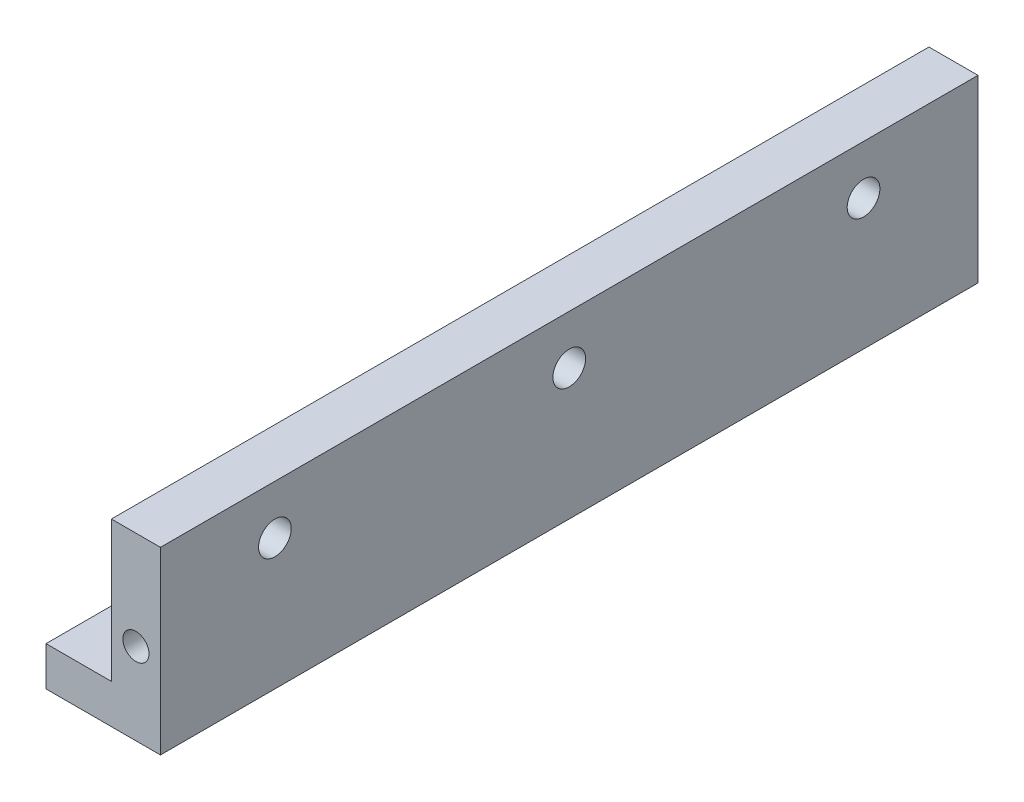
ISO-10303-21;
HEADER;
FILE_DESCRIPTION(('STEP AP214'),'2;1');
FILE_NAME('part.step','',(''),(''),'','','');
FILE_SCHEMA(('AUTOMOTIVE_DESIGN { 1 0 10303 214 1 1 1 1 }'));
ENDSEC;
DATA;
#1=APPLICATION_CONTEXT('core data for automotive mechanical design processes');
#2=APPLICATION_PROTOCOL_DEFINITION('international standard','automotive_design',2000,#1);
#3=PRODUCT_CONTEXT('',#1,'mechanical');
#4=PRODUCT('Part','Part','',(#3));
#5=PRODUCT_RELATED_PRODUCT_CATEGORY('part','',(#4));
#6=PRODUCT_DEFINITION_FORMATION('','',#4);
#7=PRODUCT_DEFINITION_CONTEXT('part definition',#1,'design');
#8=PRODUCT_DEFINITION('design','',#6,#7);
#9=PRODUCT_DEFINITION_SHAPE('','',#8);
#10=(LENGTH_UNIT() NAMED_UNIT(*) SI_UNIT(.MILLI.,.METRE.));
#11=(NAMED_UNIT(*) PLANE_ANGLE_UNIT() SI_UNIT($,.RADIAN.));
#12=(NAMED_UNIT(*) SI_UNIT($,.STERADIAN.) SOLID_ANGLE_UNIT());
#13=UNCERTAINTY_MEASURE_WITH_UNIT(LENGTH_MEASURE(1.E-05),#10,'distance_accuracy_value','');
#14=(GEOMETRIC_REPRESENTATION_CONTEXT(3) GLOBAL_UNCERTAINTY_ASSIGNED_CONTEXT((#13)) GLOBAL_UNIT_ASSIGNED_CONTEXT((#10,
#11,#12)) REPRESENTATION_CONTEXT('',''));
#15=CARTESIAN_POINT('',(0.,0.,0.));
#16=DIRECTION('',(0.,0.,1.));
#17=DIRECTION('',(1.,0.,0.));
#18=AXIS2_PLACEMENT_3D('',#15,#16,#17);
#19=CARTESIAN_POINT('',(9.98039404339138,208.805223982166,-315.192024052027));
#20=DIRECTION('',(0.,1.,0.));
#21=DIRECTION('',(0.,0.,1.));
#22=AXIS2_PLACEMENT_3D('',#19,#20,#21);
#23=PLANE('',#22);
#24=DIRECTION('',(0.,0.,1.));
#25=VECTOR('',#24,1.);
#26=CARTESIAN_POINT('',(9.98039404339138,208.805223982166,-315.192024052027));
#27=LINE('',#26,#25);
#28=CARTESIAN_POINT('',(9.98039404339138,208.805223982166,-250.));
#29=VERTEX_POINT('',#28);
#30=CARTESIAN_POINT('',(9.98039404339138,208.805223982166,0.));
#31=VERTEX_POINT('',#30);
#32=EDGE_CURVE('E96',#29,#31,#27,.T.);
#33=ORIENTED_EDGE('',*,*,#32,.F.);
#34=DIRECTION('',(-1.,0.,0.));
#35=VECTOR('',#34,1.);
#36=CARTESIAN_POINT('',(9.98039404339138,208.805223982166,-250.));
#37=LINE('',#36,#35);
#38=CARTESIAN_POINT('',(-5.01960595660862,208.805223982166,-250.));
#39=VERTEX_POINT('',#38);
#40=EDGE_CURVE('E126',#29,#39,#37,.T.);
#41=ORIENTED_EDGE('',*,*,#40,.T.);
#42=DIRECTION('',(0.,0.,1.));
#43=VECTOR('',#42,1.);
#44=CARTESIAN_POINT('',(-5.01960595660862,208.805223982166,-315.192024052027));
#45=LINE('',#44,#43);
#46=CARTESIAN_POINT('',(-5.01960595660862,208.805223982166,0.));
#47=VERTEX_POINT('',#46);
#48=EDGE_CURVE('E37',#39,#47,#45,.T.);
#49=ORIENTED_EDGE('',*,*,#48,.T.);
#50=DIRECTION('',(-1.,0.,0.));
#51=VECTOR('',#50,1.);
#52=CARTESIAN_POINT('',(9.98039404339138,208.805223982166,0.));
#53=LINE('',#52,#51);
#54=EDGE_CURVE('E121',#31,#47,#53,.T.);
#55=ORIENTED_EDGE('',*,*,#54,.F.);
#56=EDGE_LOOP('',(#33,#41,#49,#55));
#57=FACE_BOUND('',#56,.T.);
#58=ADVANCED_FACE('F33',(#57),#23,.T.);
#59=CARTESIAN_POINT('',(9.98039404339139,153.805223982166,-315.192024052027));
#60=DIRECTION('',(1.,0.,0.));
#61=DIRECTION('',(0.,1.,0.));
#62=AXIS2_PLACEMENT_3D('',#59,#60,#61);
#63=PLANE('',#62);
#64=CARTESIAN_POINT('',(9.98039404339139,193.805223982166,-35.));
#65=DIRECTION('',(1.,0.,0.));
#66=DIRECTION('',(0.,1.,0.));
#67=AXIS2_PLACEMENT_3D('',#64,#65,#66);
#68=CIRCLE('',#67,5.00000000000001);
#69=CARTESIAN_POINT('',(9.98039404339139,188.805223982166,-35.));
#70=VERTEX_POINT('',#69);
#71=EDGE_CURVE('E127',#70,#70,#68,.F.);
#72=ORIENTED_EDGE('',*,*,#71,.T.);
#73=EDGE_LOOP('',(#72));
#74=FACE_BOUND('',#73,.T.);
#75=CARTESIAN_POINT('',(9.98039404339139,193.805223982166,-125.));
#76=DIRECTION('',(1.,0.,0.));
#77=DIRECTION('',(0.,1.,0.));
#78=AXIS2_PLACEMENT_3D('',#75,#76,#77);
#79=CIRCLE('',#78,4.99999999999999);
#80=CARTESIAN_POINT('',(9.98039404339139,188.805223982166,-125.));
#81=VERTEX_POINT('',#80);
#82=EDGE_CURVE('E152',#81,#81,#79,.F.);
#83=ORIENTED_EDGE('',*,*,#82,.T.);
#84=EDGE_LOOP('',(#83));
#85=FACE_BOUND('',#84,.T.);
#86=CARTESIAN_POINT('',(9.98039404339139,193.805223982166,-215.));
#87=DIRECTION('',(1.,0.,0.));
#88=DIRECTION('',(0.,1.,0.));
#89=AXIS2_PLACEMENT_3D('',#86,#87,#88);
#90=CIRCLE('',#89,5.00000000000002);
#91=CARTESIAN_POINT('',(9.98039404339139,188.805223982166,-215.));
#92=VERTEX_POINT('',#91);
#93=EDGE_CURVE('E155',#92,#92,#90,.F.);
#94=ORIENTED_EDGE('',*,*,#93,.T.);
#95=EDGE_LOOP('',(#94));
#96=FACE_BOUND('',#95,.T.);
#97=DIRECTION('',(0.,0.,1.));
#98=VECTOR('',#97,1.);
#99=CARTESIAN_POINT('',(9.98039404339139,153.805223982166,-315.192024052027));
#100=LINE('',#99,#98);
#101=CARTESIAN_POINT('',(9.98039404339139,153.805223982166,-250.));
#102=VERTEX_POINT('',#101);
#103=CARTESIAN_POINT('',(9.98039404339139,153.805223982166,0.));
#104=VERTEX_POINT('',#103);
#105=EDGE_CURVE('E95',#102,#104,#100,.T.);
#106=ORIENTED_EDGE('',*,*,#105,.F.);
#107=DIRECTION('',(0.,1.,0.));
#108=VECTOR('',#107,1.);
#109=CARTESIAN_POINT('',(9.98039404339139,153.805223982166,-250.));
#110=LINE('',#109,#108);
#111=EDGE_CURVE('E92',#102,#29,#110,.T.);
#112=ORIENTED_EDGE('',*,*,#111,.T.);
#113=ORIENTED_EDGE('',*,*,#32,.T.);
#114=DIRECTION('',(0.,1.,0.));
#115=VECTOR('',#114,1.);
#116=CARTESIAN_POINT('',(9.98039404339139,153.805223982166,0.));
#117=LINE('',#116,#115);
#118=EDGE_CURVE('E42',#104,#31,#117,.T.);
#119=ORIENTED_EDGE('',*,*,#118,.F.);
#120=EDGE_LOOP('',(#106,#112,#113,#119));
#121=FACE_BOUND('',#120,.T.);
#122=ADVANCED_FACE('F183',(#74,#85,#96,#121),#63,.T.);
#123=CARTESIAN_POINT('',(-25.0196059566086,153.805223982166,-315.192024052027));
#124=DIRECTION('',(0.,-1.,0.));
#125=DIRECTION('',(0.,0.,-1.));
#126=AXIS2_PLACEMENT_3D('',#123,#124,#125);
#127=PLANE('',#126);
#128=DIRECTION('',(0.,0.,1.));
#129=VECTOR('',#128,1.);
#130=CARTESIAN_POINT('',(-25.0196059566086,153.805223982166,-315.192024052027));
#131=LINE('',#130,#129);
#132=CARTESIAN_POINT('',(-25.0196059566086,153.805223982166,-250.));
#133=VERTEX_POINT('',#132);
#134=CARTESIAN_POINT('',(-25.0196059566086,153.805223982166,0.));
#135=VERTEX_POINT('',#134);
#136=EDGE_CURVE('E99',#133,#135,#131,.T.);
#137=ORIENTED_EDGE('',*,*,#136,.F.);
#138=DIRECTION('',(1.,0.,0.));
#139=VECTOR('',#138,1.);
#140=CARTESIAN_POINT('',(-25.0196059566086,153.805223982166,-250.));
#141=LINE('',#140,#139);
#142=EDGE_CURVE('E85',#133,#102,#141,.T.);
#143=ORIENTED_EDGE('',*,*,#142,.T.);
#144=ORIENTED_EDGE('',*,*,#105,.T.);
#145=DIRECTION('',(1.,0.,0.));
#146=VECTOR('',#145,1.);
#147=CARTESIAN_POINT('',(-25.0196059566086,153.805223982166,0.));
#148=LINE('',#147,#146);
#149=EDGE_CURVE('E102',#135,#104,#148,.T.);
#150=ORIENTED_EDGE('',*,*,#149,.F.);
#151=EDGE_LOOP('',(#137,#143,#144,#150));
#152=FACE_BOUND('',#151,.T.);
#153=ADVANCED_FACE('F100',(#152),#127,.T.);
#154=CARTESIAN_POINT('',(-25.0196059566086,165.805223982166,-315.192024052027));
#155=DIRECTION('',(-1.,0.,0.));
#156=DIRECTION('',(0.,-1.,0.));
#157=AXIS2_PLACEMENT_3D('',#154,#155,#156);
#158=PLANE('',#157);
#159=DIRECTION('',(0.,0.,1.));
#160=VECTOR('',#159,1.);
#161=CARTESIAN_POINT('',(-25.0196059566086,165.805223982166,-315.192024052027));
#162=LINE('',#161,#160);
#163=CARTESIAN_POINT('',(-25.0196059566086,165.805223982166,-250.));
#164=VERTEX_POINT('',#163);
#165=CARTESIAN_POINT('',(-25.0196059566086,165.805223982166,0.));
#166=VERTEX_POINT('',#165);
#167=EDGE_CURVE('E108',#164,#166,#162,.T.);
#168=ORIENTED_EDGE('',*,*,#167,.F.);
#169=DIRECTION('',(0.,-1.,0.));
#170=VECTOR('',#169,1.);
#171=CARTESIAN_POINT('',(-25.0196059566086,165.805223982166,-250.));
#172=LINE('',#171,#170);
#173=EDGE_CURVE('E89',#164,#133,#172,.T.);
#174=ORIENTED_EDGE('',*,*,#173,.T.);
#175=ORIENTED_EDGE('',*,*,#136,.T.);
#176=DIRECTION('',(0.,-1.,0.));
#177=VECTOR('',#176,1.);
#178=CARTESIAN_POINT('',(-25.0196059566086,165.805223982166,0.));
#179=LINE('',#178,#177);
#180=EDGE_CURVE('E146',#166,#135,#179,.T.);
#181=ORIENTED_EDGE('',*,*,#180,.F.);
#182=EDGE_LOOP('',(#168,#174,#175,#181));
#183=FACE_BOUND('',#182,.T.);
#184=ADVANCED_FACE('F107',(#183),#158,.T.);
#185=CARTESIAN_POINT('',(-5.01960595660862,165.805223982166,-315.192024052027));
#186=DIRECTION('',(0.,1.,0.));
#187=DIRECTION('',(0.,0.,1.));
#188=AXIS2_PLACEMENT_3D('',#185,#186,#187);
#189=PLANE('',#188);
#190=DIRECTION('',(0.,0.,1.));
#191=VECTOR('',#190,1.);
#192=CARTESIAN_POINT('',(-5.01960595660862,165.805223982166,-315.192024052027));
#193=LINE('',#192,#191);
#194=CARTESIAN_POINT('',(-5.01960595660862,165.805223982166,-250.));
#195=VERTEX_POINT('',#194);
#196=CARTESIAN_POINT('',(-5.01960595660862,165.805223982166,0.));
#197=VERTEX_POINT('',#196);
#198=EDGE_CURVE('E115',#195,#197,#193,.T.);
#199=ORIENTED_EDGE('',*,*,#198,.F.);
#200=DIRECTION('',(-1.,0.,0.));
#201=VECTOR('',#200,1.);
#202=CARTESIAN_POINT('',(-5.01960595660862,165.805223982166,-250.));
#203=LINE('',#202,#201);
#204=EDGE_CURVE('E56',#195,#164,#203,.T.);
#205=ORIENTED_EDGE('',*,*,#204,.T.);
#206=ORIENTED_EDGE('',*,*,#167,.T.);
#207=DIRECTION('',(-1.,0.,0.));
#208=VECTOR('',#207,1.);
#209=CARTESIAN_POINT('',(-5.01960595660862,165.805223982166,0.));
#210=LINE('',#209,#208);
#211=EDGE_CURVE('E139',#197,#166,#210,.T.);
#212=ORIENTED_EDGE('',*,*,#211,.F.);
#213=EDGE_LOOP('',(#199,#205,#206,#212));
#214=FACE_BOUND('',#213,.T.);
#215=ADVANCED_FACE('F200',(#214),#189,.T.);
#216=CARTESIAN_POINT('',(-5.01960595660862,208.805223982166,-315.192024052027));
#217=DIRECTION('',(-1.,0.,0.));
#218=DIRECTION('',(0.,-1.,0.));
#219=AXIS2_PLACEMENT_3D('',#216,#217,#218);
#220=PLANE('',#219);
#221=CARTESIAN_POINT('',(-5.01960595660862,193.805223982166,-35.));
#222=DIRECTION('',(-1.,0.,0.));
#223=DIRECTION('',(0.,-1.,0.));
#224=AXIS2_PLACEMENT_3D('',#221,#222,#223);
#225=CIRCLE('',#224,5.00000000000001);
#226=CARTESIAN_POINT('',(-5.01960595660862,188.805223982166,-35.));
#227=VERTEX_POINT('',#226);
#228=EDGE_CURVE('E158',#227,#227,#225,.F.);
#229=ORIENTED_EDGE('',*,*,#228,.T.);
#230=EDGE_LOOP('',(#229));
#231=FACE_BOUND('',#230,.T.);
#232=CARTESIAN_POINT('',(-5.01960595660862,193.805223982166,-125.));
#233=DIRECTION('',(-1.,0.,0.));
#234=DIRECTION('',(0.,-1.,0.));
#235=AXIS2_PLACEMENT_3D('',#232,#233,#234);
#236=CIRCLE('',#235,4.99999999999999);
#237=CARTESIAN_POINT('',(-5.01960595660862,188.805223982166,-125.));
#238=VERTEX_POINT('',#237);
#239=EDGE_CURVE('E162',#238,#238,#236,.F.);
#240=ORIENTED_EDGE('',*,*,#239,.T.);
#241=EDGE_LOOP('',(#240));
#242=FACE_BOUND('',#241,.T.);
#243=CARTESIAN_POINT('',(-5.01960595660862,193.805223982166,-215.));
#244=DIRECTION('',(-1.,0.,0.));
#245=DIRECTION('',(0.,-1.,0.));
#246=AXIS2_PLACEMENT_3D('',#243,#244,#245);
#247=CIRCLE('',#246,5.00000000000002);
#248=CARTESIAN_POINT('',(-5.01960595660862,188.805223982166,-215.));
#249=VERTEX_POINT('',#248);
#250=EDGE_CURVE('E159',#249,#249,#247,.F.);
#251=ORIENTED_EDGE('',*,*,#250,.T.);
#252=EDGE_LOOP('',(#251));
#253=FACE_BOUND('',#252,.T.);
#254=ORIENTED_EDGE('',*,*,#48,.F.);
#255=DIRECTION('',(0.,-1.,0.));
#256=VECTOR('',#255,1.);
#257=CARTESIAN_POINT('',(-5.01960595660862,208.805223982166,-250.));
#258=LINE('',#257,#256);
#259=EDGE_CURVE('E50',#39,#195,#258,.T.);
#260=ORIENTED_EDGE('',*,*,#259,.T.);
#261=ORIENTED_EDGE('',*,*,#198,.T.);
#262=DIRECTION('',(0.,-1.,0.));
#263=VECTOR('',#262,1.);
#264=CARTESIAN_POINT('',(-5.01960595660862,208.805223982166,0.));
#265=LINE('',#264,#263);
#266=EDGE_CURVE('E135',#47,#197,#265,.T.);
#267=ORIENTED_EDGE('',*,*,#266,.F.);
#268=EDGE_LOOP('',(#254,#260,#261,#267));
#269=FACE_BOUND('',#268,.T.);
#270=ADVANCED_FACE('F136',(#231,#242,#253,#269),#220,.T.);
#271=CARTESIAN_POINT('',(2.48039404339139,178.805223982166,-315.192024052027));
#272=DIRECTION('',(0.,0.,1.));
#273=DIRECTION('',(1.,0.,0.));
#274=AXIS2_PLACEMENT_3D('',#271,#272,#273);
#275=CYLINDRICAL_SURFACE('',#274,4.);
#276=CARTESIAN_POINT('',(2.48039404339139,178.805223982166,0.));
#277=DIRECTION('',(0.,0.,1.));
#278=DIRECTION('',(1.,0.,0.));
#279=AXIS2_PLACEMENT_3D('',#276,#277,#278);
#280=CIRCLE('',#279,4.);
#281=CARTESIAN_POINT('',(6.48039404339139,178.805223982166,0.));
#282=VERTEX_POINT('',#281);
#283=EDGE_CURVE('E116',#282,#282,#280,.T.);
#284=ORIENTED_EDGE('',*,*,#283,.T.);
#285=EDGE_LOOP('',(#284));
#286=FACE_BOUND('',#285,.T.);
#287=CARTESIAN_POINT('',(2.48039404339139,178.805223982166,-250.));
#288=DIRECTION('',(0.,0.,-1.));
#289=DIRECTION('',(-1.,0.,0.));
#290=AXIS2_PLACEMENT_3D('',#287,#288,#289);
#291=CIRCLE('',#290,4.);
#292=CARTESIAN_POINT('',(-1.51960595660862,178.805223982166,-250.));
#293=VERTEX_POINT('',#292);
#294=EDGE_CURVE('E11',#293,#293,#291,.F.);
#295=ORIENTED_EDGE('',*,*,#294,.F.);
#296=EDGE_LOOP('',(#295));
#297=FACE_BOUND('',#296,.T.);
#298=ADVANCED_FACE('F191',(#286,#297),#275,.F.);
#299=CARTESIAN_POINT('',(0.,0.,0.));
#300=DIRECTION('',(0.,0.,1.));
#301=DIRECTION('',(1.,0.,0.));
#302=AXIS2_PLACEMENT_3D('',#299,#300,#301);
#303=PLANE('',#302);
#304=ORIENTED_EDGE('',*,*,#283,.F.);
#305=EDGE_LOOP('',(#304));
#306=FACE_BOUND('',#305,.T.);
#307=ORIENTED_EDGE('',*,*,#54,.T.);
#308=ORIENTED_EDGE('',*,*,#266,.T.);
#309=ORIENTED_EDGE('',*,*,#211,.T.);
#310=ORIENTED_EDGE('',*,*,#180,.T.);
#311=ORIENTED_EDGE('',*,*,#149,.T.);
#312=ORIENTED_EDGE('',*,*,#118,.T.);
#313=EDGE_LOOP('',(#307,#308,#309,#310,#311,#312));
#314=FACE_BOUND('',#313,.T.);
#315=ADVANCED_FACE('F141',(#306,#314),#303,.T.);
#316=CARTESIAN_POINT('',(0.,2.73827252323761,-250.));
#317=DIRECTION('',(0.,0.,-1.));
#318=DIRECTION('',(-1.,0.,0.));
#319=AXIS2_PLACEMENT_3D('',#316,#317,#318);
#320=PLANE('',#319);
#321=ORIENTED_EDGE('',*,*,#40,.F.);
#322=ORIENTED_EDGE('',*,*,#111,.F.);
#323=ORIENTED_EDGE('',*,*,#142,.F.);
#324=ORIENTED_EDGE('',*,*,#173,.F.);
#325=ORIENTED_EDGE('',*,*,#204,.F.);
#326=ORIENTED_EDGE('',*,*,#259,.F.);
#327=EDGE_LOOP('',(#321,#322,#323,#324,#325,#326));
#328=FACE_BOUND('',#327,.T.);
#329=ORIENTED_EDGE('',*,*,#294,.T.);
#330=EDGE_LOOP('',(#329));
#331=FACE_BOUND('',#330,.T.);
#332=ADVANCED_FACE('F35',(#328,#331),#320,.T.);
#333=CARTESIAN_POINT('',(9.98040604339139,193.805223982166,-215.));
#334=DIRECTION('',(-1.,0.,0.));
#335=DIRECTION('',(0.,-1.,0.));
#336=AXIS2_PLACEMENT_3D('',#333,#334,#335);
#337=CYLINDRICAL_SURFACE('',#336,5.00000000000002);
#338=CARTESIAN_POINT('',(9.98039404339139,188.805223982166,-215.));
#339=CARTESIAN_POINT('',(9.82414404339139,188.805223982166,-215.));
#340=CARTESIAN_POINT('',(9.66789404339139,188.805223982166,-215.));
#341=CARTESIAN_POINT('',(9.35539404339139,188.805223982166,-215.));
#342=CARTESIAN_POINT('',(9.19914404339139,188.805223982166,-215.));
#343=CARTESIAN_POINT('',(8.88664404339139,188.805223982166,-215.));
#344=CARTESIAN_POINT('',(8.73039404339139,188.805223982166,-215.));
#345=CARTESIAN_POINT('',(8.41789404339139,188.805223982166,-215.));
#346=CARTESIAN_POINT('',(8.26164404339139,188.805223982166,-215.));
#347=CARTESIAN_POINT('',(7.94914404339138,188.805223982166,-215.));
#348=CARTESIAN_POINT('',(7.79289404339138,188.805223982166,-215.));
#349=CARTESIAN_POINT('',(7.48039404339138,188.805223982166,-215.));
#350=CARTESIAN_POINT('',(7.32414404339138,188.805223982166,-215.));
#351=CARTESIAN_POINT('',(7.01164404339138,188.805223982166,-215.));
#352=CARTESIAN_POINT('',(6.85539404339139,188.805223982166,-215.));
#353=CARTESIAN_POINT('',(6.54289404339139,188.805223982166,-215.));
#354=CARTESIAN_POINT('',(6.38664404339138,188.805223982166,-215.));
#355=CARTESIAN_POINT('',(6.07414404339138,188.805223982166,-215.));
#356=CARTESIAN_POINT('',(5.91789404339138,188.805223982166,-215.));
#357=CARTESIAN_POINT('',(5.60539404339138,188.805223982166,-215.));
#358=CARTESIAN_POINT('',(5.44914404339138,188.805223982166,-215.));
#359=CARTESIAN_POINT('',(5.13664404339138,188.805223982166,-215.));
#360=CARTESIAN_POINT('',(4.98039404339138,188.805223982166,-215.));
#361=CARTESIAN_POINT('',(4.66789404339138,188.805223982166,-215.));
#362=CARTESIAN_POINT('',(4.51164404339138,188.805223982166,-215.));
#363=CARTESIAN_POINT('',(4.19914404339138,188.805223982166,-215.));
#364=CARTESIAN_POINT('',(4.04289404339138,188.805223982166,-215.));
#365=CARTESIAN_POINT('',(3.73039404339138,188.805223982166,-215.));
#366=CARTESIAN_POINT('',(3.57414404339138,188.805223982166,-215.));
#367=CARTESIAN_POINT('',(3.26164404339138,188.805223982166,-215.));
#368=CARTESIAN_POINT('',(3.10539404339138,188.805223982166,-215.));
#369=CARTESIAN_POINT('',(2.79289404339138,188.805223982166,-215.));
#370=CARTESIAN_POINT('',(2.63664404339138,188.805223982166,-215.));
#371=CARTESIAN_POINT('',(2.32414404339138,188.805223982166,-215.));
#372=CARTESIAN_POINT('',(2.16789404339138,188.805223982166,-215.));
#373=CARTESIAN_POINT('',(1.85539404339138,188.805223982166,-215.));
#374=CARTESIAN_POINT('',(1.69914404339138,188.805223982166,-215.));
#375=CARTESIAN_POINT('',(1.38664404339138,188.805223982166,-215.));
#376=CARTESIAN_POINT('',(1.23039404339138,188.805223982166,-215.));
#377=CARTESIAN_POINT('',(0.917894043391383,188.805223982166,-215.));
#378=CARTESIAN_POINT('',(0.761644043391383,188.805223982166,-215.));
#379=CARTESIAN_POINT('',(0.449144043391383,188.805223982166,-215.));
#380=CARTESIAN_POINT('',(0.292894043391383,188.805223982166,-215.));
#381=CARTESIAN_POINT('',(-0.0196059566086176,188.805223982166,-215.));
#382=CARTESIAN_POINT('',(-0.175855956608618,188.805223982166,-215.));
#383=CARTESIAN_POINT('',(-0.488355956608618,188.805223982166,-215.));
#384=CARTESIAN_POINT('',(-0.644605956608618,188.805223982166,-215.));
#385=CARTESIAN_POINT('',(-0.957105956608618,188.805223982166,-215.));
#386=CARTESIAN_POINT('',(-1.11335595660862,188.805223982166,-215.));
#387=CARTESIAN_POINT('',(-1.42585595660862,188.805223982166,-215.));
#388=CARTESIAN_POINT('',(-1.58210595660862,188.805223982166,-215.));
#389=CARTESIAN_POINT('',(-1.89460595660862,188.805223982166,-215.));
#390=CARTESIAN_POINT('',(-2.05085595660862,188.805223982166,-215.));
#391=CARTESIAN_POINT('',(-2.36335595660862,188.805223982166,-215.));
#392=CARTESIAN_POINT('',(-2.51960595660862,188.805223982166,-215.));
#393=CARTESIAN_POINT('',(-2.83210595660862,188.805223982166,-215.));
#394=CARTESIAN_POINT('',(-2.98835595660862,188.805223982166,-215.));
#395=CARTESIAN_POINT('',(-3.30085595660862,188.805223982166,-215.));
#396=CARTESIAN_POINT('',(-3.45710595660862,188.805223982166,-215.));
#397=CARTESIAN_POINT('',(-3.76960595660862,188.805223982166,-215.));
#398=CARTESIAN_POINT('',(-3.92585595660862,188.805223982166,-215.));
#399=CARTESIAN_POINT('',(-4.23835595660862,188.805223982166,-215.));
#400=CARTESIAN_POINT('',(-4.39460595660862,188.805223982166,-215.));
#401=CARTESIAN_POINT('',(-4.70710595660862,188.805223982166,-215.));
#402=CARTESIAN_POINT('',(-4.86335595660862,188.805223982166,-215.));
#403=CARTESIAN_POINT('',(-5.01960595660862,188.805223982166,-215.));
#404=B_SPLINE_CURVE_WITH_KNOTS('',3,(#338,#339,#340,#341,#342,#343,#344,#345,#346,#347,#348,
#349,#350,#351,#352,#353,#354,#355,#356,#357,#358,#359,#360,#361,#362,#363,#364,#365,#366,#367,
#368,#369,#370,#371,#372,#373,#374,#375,#376,#377,#378,#379,#380,#381,#382,#383,#384,#385,#386,
#387,#388,#389,#390,#391,#392,#393,#394,#395,#396,#397,#398,#399,#400,#401,#402,#403),
.UNSPECIFIED.,.F.,.F.,(4,2,2,2,2,2,2,2,2,2,2,2,2,2,2,2,2,2,2,2,2,2,2,2,2,2,2,2,2,2,2,2,4),(0.,
0.46875,0.937500000000001,1.40625,1.875,2.34375,2.8125,3.28125,3.75,4.21875,4.6875,5.15625,
5.625,6.09375,6.5625,7.03125,7.5,7.96875,8.4375,8.90625,9.375,9.84375,10.3125,10.78125,11.25,
11.71875,12.1875,12.65625,13.125,13.59375,14.0625,14.53125,15.),.UNSPECIFIED.);
#405=EDGE_CURVE('BSEAM178',#92,#249,#404,.T.);
#406=ORIENTED_EDGE('',*,*,#93,.F.);
#407=ORIENTED_EDGE('',*,*,#250,.F.);
#408=ORIENTED_EDGE('',*,*,#405,.T.);
#409=ORIENTED_EDGE('',*,*,#405,.F.);
#410=EDGE_LOOP('',(#406,#408,#407,#409));
#411=FACE_BOUND('',#410,.T.);
#412=ADVANCED_FACE('F178',(#411),#337,.F.);
#413=CARTESIAN_POINT('',(9.98040604339139,193.805223982166,-125.));
#414=DIRECTION('',(-1.,0.,0.));
#415=DIRECTION('',(0.,-1.,0.));
#416=AXIS2_PLACEMENT_3D('',#413,#414,#415);
#417=CYLINDRICAL_SURFACE('',#416,4.99999999999999);
#418=CARTESIAN_POINT('',(9.98039404339139,188.805223982166,-125.));
#419=CARTESIAN_POINT('',(9.82414404339139,188.805223982166,-125.));
#420=CARTESIAN_POINT('',(9.66789404339139,188.805223982166,-125.));
#421=CARTESIAN_POINT('',(9.35539404339139,188.805223982166,-125.));
#422=CARTESIAN_POINT('',(9.19914404339139,188.805223982166,-125.));
#423=CARTESIAN_POINT('',(8.88664404339139,188.805223982166,-125.));
#424=CARTESIAN_POINT('',(8.73039404339139,188.805223982166,-125.));
#425=CARTESIAN_POINT('',(8.41789404339139,188.805223982166,-125.));
#426=CARTESIAN_POINT('',(8.26164404339139,188.805223982166,-125.));
#427=CARTESIAN_POINT('',(7.94914404339138,188.805223982166,-125.));
#428=CARTESIAN_POINT('',(7.79289404339138,188.805223982166,-125.));
#429=CARTESIAN_POINT('',(7.48039404339138,188.805223982166,-125.));
#430=CARTESIAN_POINT('',(7.32414404339138,188.805223982166,-125.));
#431=CARTESIAN_POINT('',(7.01164404339138,188.805223982166,-125.));
#432=CARTESIAN_POINT('',(6.85539404339139,188.805223982166,-125.));
#433=CARTESIAN_POINT('',(6.54289404339139,188.805223982166,-125.));
#434=CARTESIAN_POINT('',(6.38664404339138,188.805223982166,-125.));
#435=CARTESIAN_POINT('',(6.07414404339138,188.805223982166,-125.));
#436=CARTESIAN_POINT('',(5.91789404339138,188.805223982166,-125.));
#437=CARTESIAN_POINT('',(5.60539404339138,188.805223982166,-125.));
#438=CARTESIAN_POINT('',(5.44914404339138,188.805223982166,-125.));
#439=CARTESIAN_POINT('',(5.13664404339138,188.805223982166,-125.));
#440=CARTESIAN_POINT('',(4.98039404339138,188.805223982166,-125.));
#441=CARTESIAN_POINT('',(4.66789404339138,188.805223982166,-125.));
#442=CARTESIAN_POINT('',(4.51164404339138,188.805223982166,-125.));
#443=CARTESIAN_POINT('',(4.19914404339138,188.805223982166,-125.));
#444=CARTESIAN_POINT('',(4.04289404339138,188.805223982166,-125.));
#445=CARTESIAN_POINT('',(3.73039404339138,188.805223982166,-125.));
#446=CARTESIAN_POINT('',(3.57414404339138,188.805223982166,-125.));
#447=CARTESIAN_POINT('',(3.26164404339138,188.805223982166,-125.));
#448=CARTESIAN_POINT('',(3.10539404339138,188.805223982166,-125.));
#449=CARTESIAN_POINT('',(2.79289404339138,188.805223982166,-125.));
#450=CARTESIAN_POINT('',(2.63664404339138,188.805223982166,-125.));
#451=CARTESIAN_POINT('',(2.32414404339138,188.805223982166,-125.));
#452=CARTESIAN_POINT('',(2.16789404339138,188.805223982166,-125.));
#453=CARTESIAN_POINT('',(1.85539404339138,188.805223982166,-125.));
#454=CARTESIAN_POINT('',(1.69914404339138,188.805223982166,-125.));
#455=CARTESIAN_POINT('',(1.38664404339138,188.805223982166,-125.));
#456=CARTESIAN_POINT('',(1.23039404339138,188.805223982166,-125.));
#457=CARTESIAN_POINT('',(0.917894043391383,188.805223982166,-125.));
#458=CARTESIAN_POINT('',(0.761644043391383,188.805223982166,-125.));
#459=CARTESIAN_POINT('',(0.449144043391383,188.805223982166,-125.));
#460=CARTESIAN_POINT('',(0.292894043391383,188.805223982166,-125.));
#461=CARTESIAN_POINT('',(-0.0196059566086176,188.805223982166,-125.));
#462=CARTESIAN_POINT('',(-0.175855956608618,188.805223982166,-125.));
#463=CARTESIAN_POINT('',(-0.488355956608618,188.805223982166,-125.));
#464=CARTESIAN_POINT('',(-0.644605956608618,188.805223982166,-125.));
#465=CARTESIAN_POINT('',(-0.957105956608618,188.805223982166,-125.));
#466=CARTESIAN_POINT('',(-1.11335595660862,188.805223982166,-125.));
#467=CARTESIAN_POINT('',(-1.42585595660862,188.805223982166,-125.));
#468=CARTESIAN_POINT('',(-1.58210595660862,188.805223982166,-125.));
#469=CARTESIAN_POINT('',(-1.89460595660862,188.805223982166,-125.));
#470=CARTESIAN_POINT('',(-2.05085595660862,188.805223982166,-125.));
#471=CARTESIAN_POINT('',(-2.36335595660862,188.805223982166,-125.));
#472=CARTESIAN_POINT('',(-2.51960595660862,188.805223982166,-125.));
#473=CARTESIAN_POINT('',(-2.83210595660862,188.805223982166,-125.));
#474=CARTESIAN_POINT('',(-2.98835595660862,188.805223982166,-125.));
#475=CARTESIAN_POINT('',(-3.30085595660862,188.805223982166,-125.));
#476=CARTESIAN_POINT('',(-3.45710595660862,188.805223982166,-125.));
#477=CARTESIAN_POINT('',(-3.76960595660862,188.805223982166,-125.));
#478=CARTESIAN_POINT('',(-3.92585595660862,188.805223982166,-125.));
#479=CARTESIAN_POINT('',(-4.23835595660862,188.805223982166,-125.));
#480=CARTESIAN_POINT('',(-4.39460595660862,188.805223982166,-125.));
#481=CARTESIAN_POINT('',(-4.70710595660862,188.805223982166,-125.));
#482=CARTESIAN_POINT('',(-4.86335595660862,188.805223982166,-125.));
#483=CARTESIAN_POINT('',(-5.01960595660862,188.805223982166,-125.));
#484=B_SPLINE_CURVE_WITH_KNOTS('',3,(#418,#419,#420,#421,#422,#423,#424,#425,#426,#427,#428,
#429,#430,#431,#432,#433,#434,#435,#436,#437,#438,#439,#440,#441,#442,#443,#444,#445,#446,#447,
#448,#449,#450,#451,#452,#453,#454,#455,#456,#457,#458,#459,#460,#461,#462,#463,#464,#465,#466,
#467,#468,#469,#470,#471,#472,#473,#474,#475,#476,#477,#478,#479,#480,#481,#482,#483),
.UNSPECIFIED.,.F.,.F.,(4,2,2,2,2,2,2,2,2,2,2,2,2,2,2,2,2,2,2,2,2,2,2,2,2,2,2,2,2,2,2,2,4),(0.,
0.46875,0.937500000000001,1.40625,1.875,2.34375,2.8125,3.28125,3.75,4.21875,4.6875,5.15625,
5.625,6.09375,6.5625,7.03125,7.5,7.96875,8.4375,8.90625,9.375,9.84375,10.3125,10.78125,11.25,
11.71875,12.1875,12.65625,13.125,13.59375,14.0625,14.53125,15.),.UNSPECIFIED.);
#485=EDGE_CURVE('BSEAM172',#81,#238,#484,.T.);
#486=ORIENTED_EDGE('',*,*,#82,.F.);
#487=ORIENTED_EDGE('',*,*,#239,.F.);
#488=ORIENTED_EDGE('',*,*,#485,.T.);
#489=ORIENTED_EDGE('',*,*,#485,.F.);
#490=EDGE_LOOP('',(#486,#488,#487,#489));
#491=FACE_BOUND('',#490,.T.);
#492=ADVANCED_FACE('F172',(#491),#417,.F.);
#493=CARTESIAN_POINT('',(9.98040604339139,193.805223982166,-35.));
#494=DIRECTION('',(-1.,0.,0.));
#495=DIRECTION('',(0.,-1.,0.));
#496=AXIS2_PLACEMENT_3D('',#493,#494,#495);
#497=CYLINDRICAL_SURFACE('',#496,5.00000000000001);
#498=CARTESIAN_POINT('',(9.98039404339139,188.805223982166,-35.));
#499=CARTESIAN_POINT('',(9.82414404339139,188.805223982166,-35.));
#500=CARTESIAN_POINT('',(9.66789404339139,188.805223982166,-35.));
#501=CARTESIAN_POINT('',(9.35539404339139,188.805223982166,-35.));
#502=CARTESIAN_POINT('',(9.19914404339139,188.805223982166,-35.));
#503=CARTESIAN_POINT('',(8.88664404339139,188.805223982166,-35.));
#504=CARTESIAN_POINT('',(8.73039404339139,188.805223982166,-35.));
#505=CARTESIAN_POINT('',(8.41789404339139,188.805223982166,-35.));
#506=CARTESIAN_POINT('',(8.26164404339139,188.805223982166,-35.));
#507=CARTESIAN_POINT('',(7.94914404339138,188.805223982166,-35.));
#508=CARTESIAN_POINT('',(7.79289404339138,188.805223982166,-35.));
#509=CARTESIAN_POINT('',(7.48039404339138,188.805223982166,-35.));
#510=CARTESIAN_POINT('',(7.32414404339138,188.805223982166,-35.));
#511=CARTESIAN_POINT('',(7.01164404339138,188.805223982166,-35.));
#512=CARTESIAN_POINT('',(6.85539404339139,188.805223982166,-35.));
#513=CARTESIAN_POINT('',(6.54289404339139,188.805223982166,-35.));
#514=CARTESIAN_POINT('',(6.38664404339138,188.805223982166,-35.));
#515=CARTESIAN_POINT('',(6.07414404339138,188.805223982166,-35.));
#516=CARTESIAN_POINT('',(5.91789404339138,188.805223982166,-35.));
#517=CARTESIAN_POINT('',(5.60539404339138,188.805223982166,-35.));
#518=CARTESIAN_POINT('',(5.44914404339138,188.805223982166,-35.));
#519=CARTESIAN_POINT('',(5.13664404339138,188.805223982166,-35.));
#520=CARTESIAN_POINT('',(4.98039404339138,188.805223982166,-35.));
#521=CARTESIAN_POINT('',(4.66789404339138,188.805223982166,-35.));
#522=CARTESIAN_POINT('',(4.51164404339138,188.805223982166,-35.));
#523=CARTESIAN_POINT('',(4.19914404339138,188.805223982166,-35.));
#524=CARTESIAN_POINT('',(4.04289404339138,188.805223982166,-35.));
#525=CARTESIAN_POINT('',(3.73039404339138,188.805223982166,-35.));
#526=CARTESIAN_POINT('',(3.57414404339138,188.805223982166,-35.));
#527=CARTESIAN_POINT('',(3.26164404339138,188.805223982166,-35.));
#528=CARTESIAN_POINT('',(3.10539404339138,188.805223982166,-35.));
#529=CARTESIAN_POINT('',(2.79289404339138,188.805223982166,-35.));
#530=CARTESIAN_POINT('',(2.63664404339138,188.805223982166,-35.));
#531=CARTESIAN_POINT('',(2.32414404339138,188.805223982166,-35.));
#532=CARTESIAN_POINT('',(2.16789404339138,188.805223982166,-35.));
#533=CARTESIAN_POINT('',(1.85539404339138,188.805223982166,-35.));
#534=CARTESIAN_POINT('',(1.69914404339138,188.805223982166,-35.));
#535=CARTESIAN_POINT('',(1.38664404339138,188.805223982166,-35.));
#536=CARTESIAN_POINT('',(1.23039404339138,188.805223982166,-35.));
#537=CARTESIAN_POINT('',(0.917894043391383,188.805223982166,-35.));
#538=CARTESIAN_POINT('',(0.761644043391383,188.805223982166,-35.));
#539=CARTESIAN_POINT('',(0.449144043391383,188.805223982166,-35.));
#540=CARTESIAN_POINT('',(0.292894043391383,188.805223982166,-35.));
#541=CARTESIAN_POINT('',(-0.0196059566086176,188.805223982166,-35.));
#542=CARTESIAN_POINT('',(-0.175855956608618,188.805223982166,-35.));
#543=CARTESIAN_POINT('',(-0.488355956608618,188.805223982166,-35.));
#544=CARTESIAN_POINT('',(-0.644605956608618,188.805223982166,-35.));
#545=CARTESIAN_POINT('',(-0.957105956608618,188.805223982166,-35.));
#546=CARTESIAN_POINT('',(-1.11335595660862,188.805223982166,-35.));
#547=CARTESIAN_POINT('',(-1.42585595660862,188.805223982166,-35.));
#548=CARTESIAN_POINT('',(-1.58210595660862,188.805223982166,-35.));
#549=CARTESIAN_POINT('',(-1.89460595660862,188.805223982166,-35.));
#550=CARTESIAN_POINT('',(-2.05085595660862,188.805223982166,-35.));
#551=CARTESIAN_POINT('',(-2.36335595660862,188.805223982166,-35.));
#552=CARTESIAN_POINT('',(-2.51960595660862,188.805223982166,-35.));
#553=CARTESIAN_POINT('',(-2.83210595660862,188.805223982166,-35.));
#554=CARTESIAN_POINT('',(-2.98835595660862,188.805223982166,-35.));
#555=CARTESIAN_POINT('',(-3.30085595660862,188.805223982166,-35.));
#556=CARTESIAN_POINT('',(-3.45710595660862,188.805223982166,-35.));
#557=CARTESIAN_POINT('',(-3.76960595660862,188.805223982166,-35.));
#558=CARTESIAN_POINT('',(-3.92585595660862,188.805223982166,-35.));
#559=CARTESIAN_POINT('',(-4.23835595660862,188.805223982166,-35.));
#560=CARTESIAN_POINT('',(-4.39460595660862,188.805223982166,-35.));
#561=CARTESIAN_POINT('',(-4.70710595660862,188.805223982166,-35.));
#562=CARTESIAN_POINT('',(-4.86335595660862,188.805223982166,-35.));
#563=CARTESIAN_POINT('',(-5.01960595660862,188.805223982166,-35.));
#564=B_SPLINE_CURVE_WITH_KNOTS('',3,(#498,#499,#500,#501,#502,#503,#504,#505,#506,#507,#508,
#509,#510,#511,#512,#513,#514,#515,#516,#517,#518,#519,#520,#521,#522,#523,#524,#525,#526,#527,
#528,#529,#530,#531,#532,#533,#534,#535,#536,#537,#538,#539,#540,#541,#542,#543,#544,#545,#546,
#547,#548,#549,#550,#551,#552,#553,#554,#555,#556,#557,#558,#559,#560,#561,#562,#563),
.UNSPECIFIED.,.F.,.F.,(4,2,2,2,2,2,2,2,2,2,2,2,2,2,2,2,2,2,2,2,2,2,2,2,2,2,2,2,2,2,2,2,4),(0.,
0.46875,0.937500000000001,1.40625,1.875,2.34375,2.8125,3.28125,3.75,4.21875,4.6875,5.15625,
5.625,6.09375,6.5625,7.03125,7.5,7.96875,8.4375,8.90625,9.375,9.84375,10.3125,10.78125,11.25,
11.71875,12.1875,12.65625,13.125,13.59375,14.0625,14.53125,15.),.UNSPECIFIED.);
#565=EDGE_CURVE('BSEAM170',#70,#227,#564,.T.);
#566=ORIENTED_EDGE('',*,*,#71,.F.);
#567=ORIENTED_EDGE('',*,*,#228,.F.);
#568=ORIENTED_EDGE('',*,*,#565,.T.);
#569=ORIENTED_EDGE('',*,*,#565,.F.);
#570=EDGE_LOOP('',(#566,#568,#567,#569));
#571=FACE_BOUND('',#570,.T.);
#572=ADVANCED_FACE('F170',(#571),#497,.F.);
#573=CLOSED_SHELL('',(#58,#122,#153,#184,#215,#270,#298,#315,#332,#412,#492,#572));
#574=MANIFOLD_SOLID_BREP('B2',#573);
#575=ADVANCED_BREP_SHAPE_REPRESENTATION('',(#18,#574),#14);
#576=SHAPE_DEFINITION_REPRESENTATION(#9,#575);
ENDSEC;
END-ISO-10303-21;
